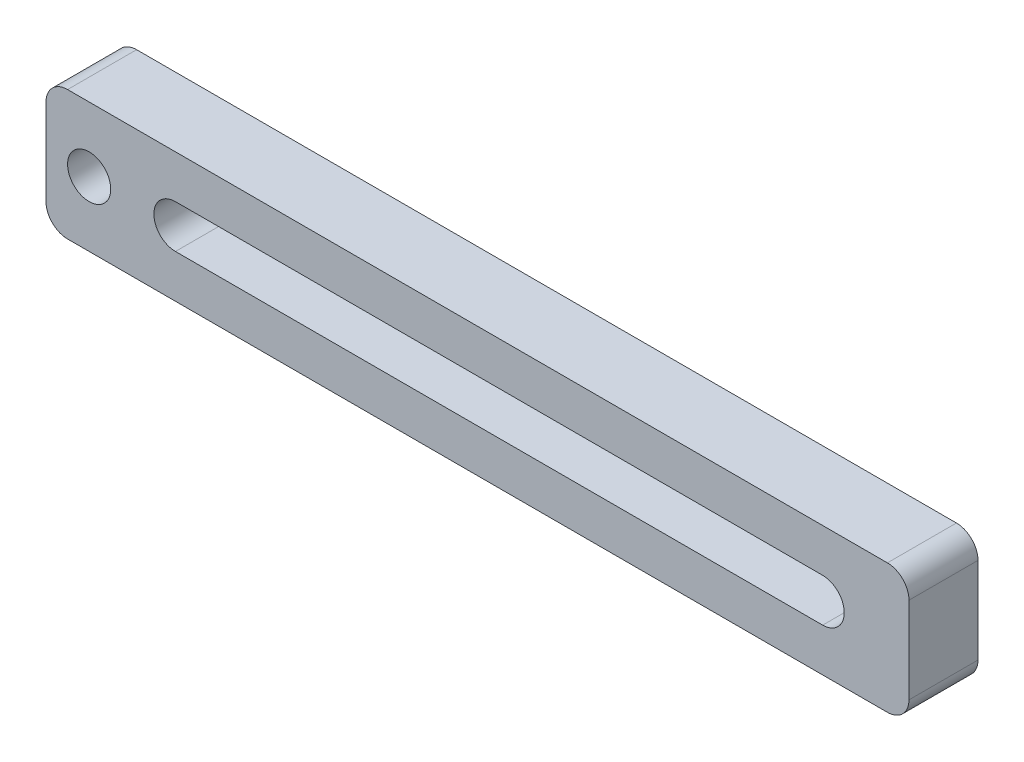
ISO-10303-21;
HEADER;
FILE_DESCRIPTION(('STEP AP214'),'2;1');
FILE_NAME('part.step','',(''),(''),'','','');
FILE_SCHEMA(('AUTOMOTIVE_DESIGN { 1 0 10303 214 1 1 1 1 }'));
ENDSEC;
DATA;
#1=APPLICATION_CONTEXT('core data for automotive mechanical design processes');
#2=APPLICATION_PROTOCOL_DEFINITION('international standard','automotive_design',2000,#1);
#3=PRODUCT_CONTEXT('',#1,'mechanical');
#4=PRODUCT('Part','Part','',(#3));
#5=PRODUCT_RELATED_PRODUCT_CATEGORY('part','',(#4));
#6=PRODUCT_DEFINITION_FORMATION('','',#4);
#7=PRODUCT_DEFINITION_CONTEXT('part definition',#1,'design');
#8=PRODUCT_DEFINITION('design','',#6,#7);
#9=PRODUCT_DEFINITION_SHAPE('','',#8);
#10=(LENGTH_UNIT() NAMED_UNIT(*) SI_UNIT(.MILLI.,.METRE.));
#11=(NAMED_UNIT(*) PLANE_ANGLE_UNIT() SI_UNIT($,.RADIAN.));
#12=(NAMED_UNIT(*) SI_UNIT($,.STERADIAN.) SOLID_ANGLE_UNIT());
#13=UNCERTAINTY_MEASURE_WITH_UNIT(LENGTH_MEASURE(1.E-05),#10,'distance_accuracy_value','');
#14=(GEOMETRIC_REPRESENTATION_CONTEXT(3) GLOBAL_UNCERTAINTY_ASSIGNED_CONTEXT((#13)) GLOBAL_UNIT_ASSIGNED_CONTEXT((#10,
#11,#12)) REPRESENTATION_CONTEXT('',''));
#15=CARTESIAN_POINT('',(0.,0.,0.));
#16=DIRECTION('',(0.,0.,1.));
#17=DIRECTION('',(1.,0.,0.));
#18=AXIS2_PLACEMENT_3D('',#15,#16,#17);
#19=CARTESIAN_POINT('',(0.,0.,8.));
#20=DIRECTION('',(1.,0.,0.));
#21=DIRECTION('',(0.,0.,-1.));
#22=AXIS2_PLACEMENT_3D('',#19,#20,#21);
#23=PLANE('',#22);
#24=DIRECTION('',(0.,-1.,0.));
#25=VECTOR('',#24,1.);
#26=CARTESIAN_POINT('',(0.,0.,0.));
#27=LINE('',#26,#25);
#28=CARTESIAN_POINT('',(0.,12.5,0.));
#29=VERTEX_POINT('',#28);
#30=CARTESIAN_POINT('',(0.,2.5,0.));
#31=VERTEX_POINT('',#30);
#32=EDGE_CURVE('E167',#29,#31,#27,.T.);
#33=ORIENTED_EDGE('',*,*,#32,.T.);
#34=DIRECTION('',(0.,0.,-1.));
#35=VECTOR('',#34,1.);
#36=CARTESIAN_POINT('',(0.,2.5,8.));
#37=LINE('',#36,#35);
#38=CARTESIAN_POINT('',(0.,2.5,8.));
#39=VERTEX_POINT('',#38);
#40=EDGE_CURVE('E11',#31,#39,#37,.F.);
#41=ORIENTED_EDGE('',*,*,#40,.T.);
#42=DIRECTION('',(0.,-1.,0.));
#43=VECTOR('',#42,1.);
#44=CARTESIAN_POINT('',(0.,0.,8.));
#45=LINE('',#44,#43);
#46=CARTESIAN_POINT('',(0.,12.5,8.));
#47=VERTEX_POINT('',#46);
#48=EDGE_CURVE('E171',#47,#39,#45,.T.);
#49=ORIENTED_EDGE('',*,*,#48,.F.);
#50=DIRECTION('',(0.,0.,-1.));
#51=VECTOR('',#50,1.);
#52=CARTESIAN_POINT('',(0.,12.5,8.));
#53=LINE('',#52,#51);
#54=EDGE_CURVE('E41',#47,#29,#53,.T.);
#55=ORIENTED_EDGE('',*,*,#54,.T.);
#56=EDGE_LOOP('',(#33,#41,#49,#55));
#57=FACE_BOUND('',#56,.T.);
#58=ADVANCED_FACE('F33',(#57),#23,.F.);
#59=CARTESIAN_POINT('',(0.,0.,8.));
#60=DIRECTION('',(0.,1.,0.));
#61=DIRECTION('',(0.,0.,1.));
#62=AXIS2_PLACEMENT_3D('',#59,#60,#61);
#63=PLANE('',#62);
#64=DIRECTION('',(1.,0.,0.));
#65=VECTOR('',#64,1.);
#66=CARTESIAN_POINT('',(0.,0.,0.));
#67=LINE('',#66,#65);
#68=CARTESIAN_POINT('',(2.5,0.,0.));
#69=VERTEX_POINT('',#68);
#70=CARTESIAN_POINT('',(97.5,0.,0.));
#71=VERTEX_POINT('',#70);
#72=EDGE_CURVE('E185',#69,#71,#67,.T.);
#73=ORIENTED_EDGE('',*,*,#72,.T.);
#74=DIRECTION('',(0.,0.,-1.));
#75=VECTOR('',#74,1.);
#76=CARTESIAN_POINT('',(97.5,0.,8.));
#77=LINE('',#76,#75);
#78=CARTESIAN_POINT('',(97.5,0.,8.));
#79=VERTEX_POINT('',#78);
#80=EDGE_CURVE('E207',#71,#79,#77,.F.);
#81=ORIENTED_EDGE('',*,*,#80,.T.);
#82=DIRECTION('',(1.,0.,0.));
#83=VECTOR('',#82,1.);
#84=CARTESIAN_POINT('',(0.,0.,8.));
#85=LINE('',#84,#83);
#86=CARTESIAN_POINT('',(2.5,0.,8.));
#87=VERTEX_POINT('',#86);
#88=EDGE_CURVE('E174',#87,#79,#85,.T.);
#89=ORIENTED_EDGE('',*,*,#88,.F.);
#90=DIRECTION('',(0.,0.,-1.));
#91=VECTOR('',#90,1.);
#92=CARTESIAN_POINT('',(2.5,0.,8.));
#93=LINE('',#92,#91);
#94=EDGE_CURVE('E204',#87,#69,#93,.T.);
#95=ORIENTED_EDGE('',*,*,#94,.T.);
#96=EDGE_LOOP('',(#73,#81,#89,#95));
#97=FACE_BOUND('',#96,.T.);
#98=ADVANCED_FACE('F236',(#97),#63,.F.);
#99=CARTESIAN_POINT('',(100.,0.,8.));
#100=DIRECTION('',(-1.,0.,0.));
#101=DIRECTION('',(0.,0.,1.));
#102=AXIS2_PLACEMENT_3D('',#99,#100,#101);
#103=PLANE('',#102);
#104=DIRECTION('',(0.,1.,0.));
#105=VECTOR('',#104,1.);
#106=CARTESIAN_POINT('',(100.,0.,8.));
#107=LINE('',#106,#105);
#108=CARTESIAN_POINT('',(100.,2.5,8.));
#109=VERTEX_POINT('',#108);
#110=CARTESIAN_POINT('',(100.,12.5,8.));
#111=VERTEX_POINT('',#110);
#112=EDGE_CURVE('E178',#109,#111,#107,.T.);
#113=ORIENTED_EDGE('',*,*,#112,.F.);
#114=DIRECTION('',(0.,0.,-1.));
#115=VECTOR('',#114,1.);
#116=CARTESIAN_POINT('',(100.,2.5,8.));
#117=LINE('',#116,#115);
#118=CARTESIAN_POINT('',(100.,2.5,0.));
#119=VERTEX_POINT('',#118);
#120=EDGE_CURVE('E193',#109,#119,#117,.T.);
#121=ORIENTED_EDGE('',*,*,#120,.T.);
#122=DIRECTION('',(0.,1.,0.));
#123=VECTOR('',#122,1.);
#124=CARTESIAN_POINT('',(100.,0.,0.));
#125=LINE('',#124,#123);
#126=CARTESIAN_POINT('',(100.,12.5,0.));
#127=VERTEX_POINT('',#126);
#128=EDGE_CURVE('E188',#119,#127,#125,.T.);
#129=ORIENTED_EDGE('',*,*,#128,.T.);
#130=DIRECTION('',(0.,0.,-1.));
#131=VECTOR('',#130,1.);
#132=CARTESIAN_POINT('',(100.,12.5,8.));
#133=LINE('',#132,#131);
#134=EDGE_CURVE('E182',#127,#111,#133,.F.);
#135=ORIENTED_EDGE('',*,*,#134,.T.);
#136=EDGE_LOOP('',(#113,#121,#129,#135));
#137=FACE_BOUND('',#136,.T.);
#138=ADVANCED_FACE('F245',(#137),#103,.F.);
#139=CARTESIAN_POINT('',(0.,15.,8.));
#140=DIRECTION('',(0.,-1.,0.));
#141=DIRECTION('',(0.,0.,-1.));
#142=AXIS2_PLACEMENT_3D('',#139,#140,#141);
#143=PLANE('',#142);
#144=DIRECTION('',(-1.,0.,0.));
#145=VECTOR('',#144,1.);
#146=CARTESIAN_POINT('',(0.,15.,8.));
#147=LINE('',#146,#145);
#148=CARTESIAN_POINT('',(97.5,15.,8.));
#149=VERTEX_POINT('',#148);
#150=CARTESIAN_POINT('',(2.5,15.,8.));
#151=VERTEX_POINT('',#150);
#152=EDGE_CURVE('E180',#149,#151,#147,.T.);
#153=ORIENTED_EDGE('',*,*,#152,.F.);
#154=DIRECTION('',(0.,0.,-1.));
#155=VECTOR('',#154,1.);
#156=CARTESIAN_POINT('',(97.5,15.,8.));
#157=LINE('',#156,#155);
#158=CARTESIAN_POINT('',(97.5,15.,0.));
#159=VERTEX_POINT('',#158);
#160=EDGE_CURVE('E217',#149,#159,#157,.T.);
#161=ORIENTED_EDGE('',*,*,#160,.T.);
#162=DIRECTION('',(-1.,0.,0.));
#163=VECTOR('',#162,1.);
#164=CARTESIAN_POINT('',(0.,15.,0.));
#165=LINE('',#164,#163);
#166=CARTESIAN_POINT('',(2.5,15.,0.));
#167=VERTEX_POINT('',#166);
#168=EDGE_CURVE('E175',#159,#167,#165,.T.);
#169=ORIENTED_EDGE('',*,*,#168,.T.);
#170=DIRECTION('',(0.,0.,-1.));
#171=VECTOR('',#170,1.);
#172=CARTESIAN_POINT('',(2.5,15.,8.));
#173=LINE('',#172,#171);
#174=EDGE_CURVE('E48',#167,#151,#173,.F.);
#175=ORIENTED_EDGE('',*,*,#174,.T.);
#176=EDGE_LOOP('',(#153,#161,#169,#175));
#177=FACE_BOUND('',#176,.T.);
#178=ADVANCED_FACE('F250',(#177),#143,.F.);
#179=CARTESIAN_POINT('',(0.,15.,8.));
#180=DIRECTION('',(0.,0.,-1.));
#181=DIRECTION('',(-1.,0.,0.));
#182=AXIS2_PLACEMENT_3D('',#179,#180,#181);
#183=PLANE('',#182);
#184=CARTESIAN_POINT('',(5.,7.5,8.));
#185=DIRECTION('',(0.,0.,1.));
#186=DIRECTION('',(1.,0.,0.));
#187=AXIS2_PLACEMENT_3D('',#184,#185,#186);
#188=CIRCLE('',#187,2.5);
#189=CARTESIAN_POINT('',(7.5,7.5,8.));
#190=VERTEX_POINT('',#189);
#191=EDGE_CURVE('E154',#190,#190,#188,.T.);
#192=ORIENTED_EDGE('',*,*,#191,.F.);
#193=EDGE_LOOP('',(#192));
#194=FACE_BOUND('',#193,.T.);
#195=DIRECTION('',(1.,0.,0.));
#196=VECTOR('',#195,1.);
#197=CARTESIAN_POINT('',(15.,5.,8.));
#198=LINE('',#197,#196);
#199=CARTESIAN_POINT('',(15.,5.,8.));
#200=VERTEX_POINT('',#199);
#201=CARTESIAN_POINT('',(90.,5.,8.));
#202=VERTEX_POINT('',#201);
#203=EDGE_CURVE('E160',#200,#202,#198,.T.);
#204=ORIENTED_EDGE('',*,*,#203,.F.);
#205=CARTESIAN_POINT('',(15.,7.5,8.));
#206=DIRECTION('',(0.,0.,1.));
#207=DIRECTION('',(1.,0.,0.));
#208=AXIS2_PLACEMENT_3D('',#205,#206,#207);
#209=CIRCLE('',#208,2.5);
#210=CARTESIAN_POINT('',(15.,10.,8.));
#211=VERTEX_POINT('',#210);
#212=EDGE_CURVE('E130',#211,#200,#209,.T.);
#213=ORIENTED_EDGE('',*,*,#212,.F.);
#214=DIRECTION('',(-1.,0.,0.));
#215=VECTOR('',#214,1.);
#216=CARTESIAN_POINT('',(15.,10.,8.));
#217=LINE('',#216,#215);
#218=CARTESIAN_POINT('',(90.,10.,8.));
#219=VERTEX_POINT('',#218);
#220=EDGE_CURVE('E148',#219,#211,#217,.T.);
#221=ORIENTED_EDGE('',*,*,#220,.F.);
#222=CARTESIAN_POINT('',(90.,7.5,8.));
#223=DIRECTION('',(0.,0.,1.));
#224=DIRECTION('',(-1.,0.,0.));
#225=AXIS2_PLACEMENT_3D('',#222,#223,#224);
#226=CIRCLE('',#225,2.5);
#227=EDGE_CURVE('E151',#202,#219,#226,.T.);
#228=ORIENTED_EDGE('',*,*,#227,.F.);
#229=EDGE_LOOP('',(#204,#213,#221,#228));
#230=FACE_BOUND('',#229,.T.);
#231=ORIENTED_EDGE('',*,*,#88,.T.);
#232=CARTESIAN_POINT('',(97.5,2.5,8.));
#233=DIRECTION('',(0.,0.,-1.));
#234=DIRECTION('',(-1.,0.,0.));
#235=AXIS2_PLACEMENT_3D('',#232,#233,#234);
#236=CIRCLE('',#235,2.5);
#237=EDGE_CURVE('E214',#79,#109,#236,.F.);
#238=ORIENTED_EDGE('',*,*,#237,.T.);
#239=ORIENTED_EDGE('',*,*,#112,.T.);
#240=CARTESIAN_POINT('',(97.5,12.5,8.));
#241=DIRECTION('',(0.,0.,-1.));
#242=DIRECTION('',(-1.,0.,0.));
#243=AXIS2_PLACEMENT_3D('',#240,#241,#242);
#244=CIRCLE('',#243,2.5);
#245=EDGE_CURVE('E55',#111,#149,#244,.F.);
#246=ORIENTED_EDGE('',*,*,#245,.T.);
#247=ORIENTED_EDGE('',*,*,#152,.T.);
#248=CARTESIAN_POINT('',(2.5,12.5,8.));
#249=DIRECTION('',(0.,0.,-1.));
#250=DIRECTION('',(-1.,0.,0.));
#251=AXIS2_PLACEMENT_3D('',#248,#249,#250);
#252=CIRCLE('',#251,2.5);
#253=EDGE_CURVE('E209',#151,#47,#252,.F.);
#254=ORIENTED_EDGE('',*,*,#253,.T.);
#255=ORIENTED_EDGE('',*,*,#48,.T.);
#256=CARTESIAN_POINT('',(2.5,2.5,8.));
#257=DIRECTION('',(0.,0.,-1.));
#258=DIRECTION('',(-1.,0.,0.));
#259=AXIS2_PLACEMENT_3D('',#256,#257,#258);
#260=CIRCLE('',#259,2.5);
#261=EDGE_CURVE('E211',#39,#87,#260,.F.);
#262=ORIENTED_EDGE('',*,*,#261,.T.);
#263=EDGE_LOOP('',(#231,#238,#239,#246,#247,#254,#255,#262));
#264=FACE_BOUND('',#263,.T.);
#265=ADVANCED_FACE('F239',(#194,#230,#264),#183,.F.);
#266=CARTESIAN_POINT('',(0.,15.,0.));
#267=DIRECTION('',(0.,0.,-1.));
#268=DIRECTION('',(-1.,0.,0.));
#269=AXIS2_PLACEMENT_3D('',#266,#267,#268);
#270=PLANE('',#269);
#271=CARTESIAN_POINT('',(5.,7.5,0.));
#272=DIRECTION('',(0.,0.,1.));
#273=DIRECTION('',(1.,0.,0.));
#274=AXIS2_PLACEMENT_3D('',#271,#272,#273);
#275=CIRCLE('',#274,2.5);
#276=CARTESIAN_POINT('',(7.5,7.5,0.));
#277=VERTEX_POINT('',#276);
#278=EDGE_CURVE('E161',#277,#277,#275,.T.);
#279=ORIENTED_EDGE('',*,*,#278,.T.);
#280=EDGE_LOOP('',(#279));
#281=FACE_BOUND('',#280,.T.);
#282=CARTESIAN_POINT('',(15.,7.5,0.));
#283=DIRECTION('',(0.,0.,1.));
#284=DIRECTION('',(1.,0.,0.));
#285=AXIS2_PLACEMENT_3D('',#282,#283,#284);
#286=CIRCLE('',#285,2.5);
#287=CARTESIAN_POINT('',(15.,10.,0.));
#288=VERTEX_POINT('',#287);
#289=CARTESIAN_POINT('',(15.,5.,0.));
#290=VERTEX_POINT('',#289);
#291=EDGE_CURVE('E127',#288,#290,#286,.T.);
#292=ORIENTED_EDGE('',*,*,#291,.T.);
#293=DIRECTION('',(1.,0.,0.));
#294=VECTOR('',#293,1.);
#295=CARTESIAN_POINT('',(15.,5.,0.));
#296=LINE('',#295,#294);
#297=CARTESIAN_POINT('',(90.,5.,0.));
#298=VERTEX_POINT('',#297);
#299=EDGE_CURVE('E139',#290,#298,#296,.T.);
#300=ORIENTED_EDGE('',*,*,#299,.T.);
#301=CARTESIAN_POINT('',(90.,7.5,0.));
#302=DIRECTION('',(0.,0.,1.));
#303=DIRECTION('',(-1.,0.,0.));
#304=AXIS2_PLACEMENT_3D('',#301,#302,#303);
#305=CIRCLE('',#304,2.5);
#306=CARTESIAN_POINT('',(90.,10.,0.));
#307=VERTEX_POINT('',#306);
#308=EDGE_CURVE('E143',#298,#307,#305,.T.);
#309=ORIENTED_EDGE('',*,*,#308,.T.);
#310=DIRECTION('',(-1.,0.,0.));
#311=VECTOR('',#310,1.);
#312=CARTESIAN_POINT('',(15.,10.,0.));
#313=LINE('',#312,#311);
#314=EDGE_CURVE('E135',#307,#288,#313,.T.);
#315=ORIENTED_EDGE('',*,*,#314,.T.);
#316=EDGE_LOOP('',(#292,#300,#309,#315));
#317=FACE_BOUND('',#316,.T.);
#318=ORIENTED_EDGE('',*,*,#128,.F.);
#319=CARTESIAN_POINT('',(97.5,2.5,0.));
#320=DIRECTION('',(0.,0.,-1.));
#321=DIRECTION('',(-1.,0.,0.));
#322=AXIS2_PLACEMENT_3D('',#319,#320,#321);
#323=CIRCLE('',#322,2.5);
#324=EDGE_CURVE('E202',#119,#71,#323,.T.);
#325=ORIENTED_EDGE('',*,*,#324,.T.);
#326=ORIENTED_EDGE('',*,*,#72,.F.);
#327=CARTESIAN_POINT('',(2.5,2.5,0.));
#328=DIRECTION('',(0.,0.,-1.));
#329=DIRECTION('',(-1.,0.,0.));
#330=AXIS2_PLACEMENT_3D('',#327,#328,#329);
#331=CIRCLE('',#330,2.5);
#332=EDGE_CURVE('E198',#69,#31,#331,.T.);
#333=ORIENTED_EDGE('',*,*,#332,.T.);
#334=ORIENTED_EDGE('',*,*,#32,.F.);
#335=CARTESIAN_POINT('',(2.5,12.5,0.));
#336=DIRECTION('',(0.,0.,-1.));
#337=DIRECTION('',(-1.,0.,0.));
#338=AXIS2_PLACEMENT_3D('',#335,#336,#337);
#339=CIRCLE('',#338,2.5);
#340=EDGE_CURVE('E196',#29,#167,#339,.T.);
#341=ORIENTED_EDGE('',*,*,#340,.T.);
#342=ORIENTED_EDGE('',*,*,#168,.F.);
#343=CARTESIAN_POINT('',(97.5,12.5,0.));
#344=DIRECTION('',(0.,0.,-1.));
#345=DIRECTION('',(-1.,0.,0.));
#346=AXIS2_PLACEMENT_3D('',#343,#344,#345);
#347=CIRCLE('',#346,2.5);
#348=EDGE_CURVE('E200',#159,#127,#347,.T.);
#349=ORIENTED_EDGE('',*,*,#348,.T.);
#350=EDGE_LOOP('',(#318,#325,#326,#333,#334,#341,#342,#349));
#351=FACE_BOUND('',#350,.T.);
#352=ADVANCED_FACE('F145',(#281,#317,#351),#270,.T.);
#353=CARTESIAN_POINT('',(15.,7.5,0.));
#354=DIRECTION('',(0.,0.,1.));
#355=DIRECTION('',(1.,0.,0.));
#356=AXIS2_PLACEMENT_3D('',#353,#354,#355);
#357=CYLINDRICAL_SURFACE('',#356,2.5);
#358=ORIENTED_EDGE('',*,*,#212,.T.);
#359=DIRECTION('',(0.,0.,1.));
#360=VECTOR('',#359,1.);
#361=CARTESIAN_POINT('',(15.,5.,0.));
#362=LINE('',#361,#360);
#363=EDGE_CURVE('E123',#290,#200,#362,.T.);
#364=ORIENTED_EDGE('',*,*,#363,.F.);
#365=ORIENTED_EDGE('',*,*,#291,.F.);
#366=DIRECTION('',(0.,0.,1.));
#367=VECTOR('',#366,1.);
#368=CARTESIAN_POINT('',(15.,10.,0.));
#369=LINE('',#368,#367);
#370=EDGE_CURVE('E165',#288,#211,#369,.T.);
#371=ORIENTED_EDGE('',*,*,#370,.T.);
#372=EDGE_LOOP('',(#358,#364,#365,#371));
#373=FACE_BOUND('',#372,.T.);
#374=ADVANCED_FACE('F125',(#373),#357,.F.);
#375=CARTESIAN_POINT('',(15.,10.,0.));
#376=DIRECTION('',(0.,1.,0.));
#377=DIRECTION('',(0.,0.,1.));
#378=AXIS2_PLACEMENT_3D('',#375,#376,#377);
#379=PLANE('',#378);
#380=ORIENTED_EDGE('',*,*,#220,.T.);
#381=ORIENTED_EDGE('',*,*,#370,.F.);
#382=ORIENTED_EDGE('',*,*,#314,.F.);
#383=DIRECTION('',(0.,0.,1.));
#384=VECTOR('',#383,1.);
#385=CARTESIAN_POINT('',(90.,10.,0.));
#386=LINE('',#385,#384);
#387=EDGE_CURVE('E168',#307,#219,#386,.T.);
#388=ORIENTED_EDGE('',*,*,#387,.T.);
#389=EDGE_LOOP('',(#380,#381,#382,#388));
#390=FACE_BOUND('',#389,.T.);
#391=ADVANCED_FACE('F312',(#390),#379,.F.);
#392=CARTESIAN_POINT('',(90.,7.5,0.));
#393=DIRECTION('',(0.,0.,1.));
#394=DIRECTION('',(1.,0.,0.));
#395=AXIS2_PLACEMENT_3D('',#392,#393,#394);
#396=CYLINDRICAL_SURFACE('',#395,2.5);
#397=ORIENTED_EDGE('',*,*,#227,.T.);
#398=ORIENTED_EDGE('',*,*,#387,.F.);
#399=ORIENTED_EDGE('',*,*,#308,.F.);
#400=DIRECTION('',(0.,0.,1.));
#401=VECTOR('',#400,1.);
#402=CARTESIAN_POINT('',(90.,5.,0.));
#403=LINE('',#402,#401);
#404=EDGE_CURVE('E134',#298,#202,#403,.T.);
#405=ORIENTED_EDGE('',*,*,#404,.T.);
#406=EDGE_LOOP('',(#397,#398,#399,#405));
#407=FACE_BOUND('',#406,.T.);
#408=ADVANCED_FACE('F304',(#407),#396,.F.);
#409=CARTESIAN_POINT('',(15.,5.,0.));
#410=DIRECTION('',(0.,-1.,0.));
#411=DIRECTION('',(0.,0.,-1.));
#412=AXIS2_PLACEMENT_3D('',#409,#410,#411);
#413=PLANE('',#412);
#414=ORIENTED_EDGE('',*,*,#203,.T.);
#415=ORIENTED_EDGE('',*,*,#404,.F.);
#416=ORIENTED_EDGE('',*,*,#299,.F.);
#417=ORIENTED_EDGE('',*,*,#363,.T.);
#418=EDGE_LOOP('',(#414,#415,#416,#417));
#419=FACE_BOUND('',#418,.T.);
#420=ADVANCED_FACE('F140',(#419),#413,.F.);
#421=CARTESIAN_POINT('',(5.,7.5,0.));
#422=DIRECTION('',(0.,0.,1.));
#423=DIRECTION('',(1.,0.,0.));
#424=AXIS2_PLACEMENT_3D('',#421,#422,#423);
#425=CYLINDRICAL_SURFACE('',#424,2.5);
#426=ORIENTED_EDGE('',*,*,#278,.F.);
#427=EDGE_LOOP('',(#426));
#428=FACE_BOUND('',#427,.T.);
#429=ORIENTED_EDGE('',*,*,#191,.T.);
#430=EDGE_LOOP('',(#429));
#431=FACE_BOUND('',#430,.T.);
#432=ADVANCED_FACE('F265',(#428,#431),#425,.F.);
#433=CARTESIAN_POINT('',(97.5,2.5,8.));
#434=DIRECTION('',(0.,0.,-1.));
#435=DIRECTION('',(-1.,0.,0.));
#436=AXIS2_PLACEMENT_3D('',#433,#434,#435);
#437=CYLINDRICAL_SURFACE('',#436,2.5);
#438=ORIENTED_EDGE('',*,*,#237,.F.);
#439=ORIENTED_EDGE('',*,*,#80,.F.);
#440=ORIENTED_EDGE('',*,*,#324,.F.);
#441=ORIENTED_EDGE('',*,*,#120,.F.);
#442=EDGE_LOOP('',(#438,#439,#440,#441));
#443=FACE_BOUND('',#442,.T.);
#444=ADVANCED_FACE('F243',(#443),#437,.T.);
#445=CARTESIAN_POINT('',(97.5,12.5,8.));
#446=DIRECTION('',(0.,0.,-1.));
#447=DIRECTION('',(-1.,0.,0.));
#448=AXIS2_PLACEMENT_3D('',#445,#446,#447);
#449=CYLINDRICAL_SURFACE('',#448,2.5);
#450=ORIENTED_EDGE('',*,*,#245,.F.);
#451=ORIENTED_EDGE('',*,*,#134,.F.);
#452=ORIENTED_EDGE('',*,*,#348,.F.);
#453=ORIENTED_EDGE('',*,*,#160,.F.);
#454=EDGE_LOOP('',(#450,#451,#452,#453));
#455=FACE_BOUND('',#454,.T.);
#456=ADVANCED_FACE('F249',(#455),#449,.T.);
#457=CARTESIAN_POINT('',(2.5,2.5,8.));
#458=DIRECTION('',(0.,0.,-1.));
#459=DIRECTION('',(-1.,0.,0.));
#460=AXIS2_PLACEMENT_3D('',#457,#458,#459);
#461=CYLINDRICAL_SURFACE('',#460,2.5);
#462=ORIENTED_EDGE('',*,*,#261,.F.);
#463=ORIENTED_EDGE('',*,*,#40,.F.);
#464=ORIENTED_EDGE('',*,*,#332,.F.);
#465=ORIENTED_EDGE('',*,*,#94,.F.);
#466=EDGE_LOOP('',(#462,#463,#464,#465));
#467=FACE_BOUND('',#466,.T.);
#468=ADVANCED_FACE('F233',(#467),#461,.T.);
#469=CARTESIAN_POINT('',(2.5,12.5,8.));
#470=DIRECTION('',(0.,0.,-1.));
#471=DIRECTION('',(-1.,0.,0.));
#472=AXIS2_PLACEMENT_3D('',#469,#470,#471);
#473=CYLINDRICAL_SURFACE('',#472,2.5);
#474=ORIENTED_EDGE('',*,*,#253,.F.);
#475=ORIENTED_EDGE('',*,*,#174,.F.);
#476=ORIENTED_EDGE('',*,*,#340,.F.);
#477=ORIENTED_EDGE('',*,*,#54,.F.);
#478=EDGE_LOOP('',(#474,#475,#476,#477));
#479=FACE_BOUND('',#478,.T.);
#480=ADVANCED_FACE('F35',(#479),#473,.T.);
#481=CLOSED_SHELL('',(#58,#98,#138,#178,#265,#352,#374,#391,#408,#420,#432,#444,#456,#468,#480));
#482=MANIFOLD_SOLID_BREP('B2',#481);
#483=ADVANCED_BREP_SHAPE_REPRESENTATION('',(#18,#482),#14);
#484=SHAPE_DEFINITION_REPRESENTATION(#9,#483);
ENDSEC;
END-ISO-10303-21;
